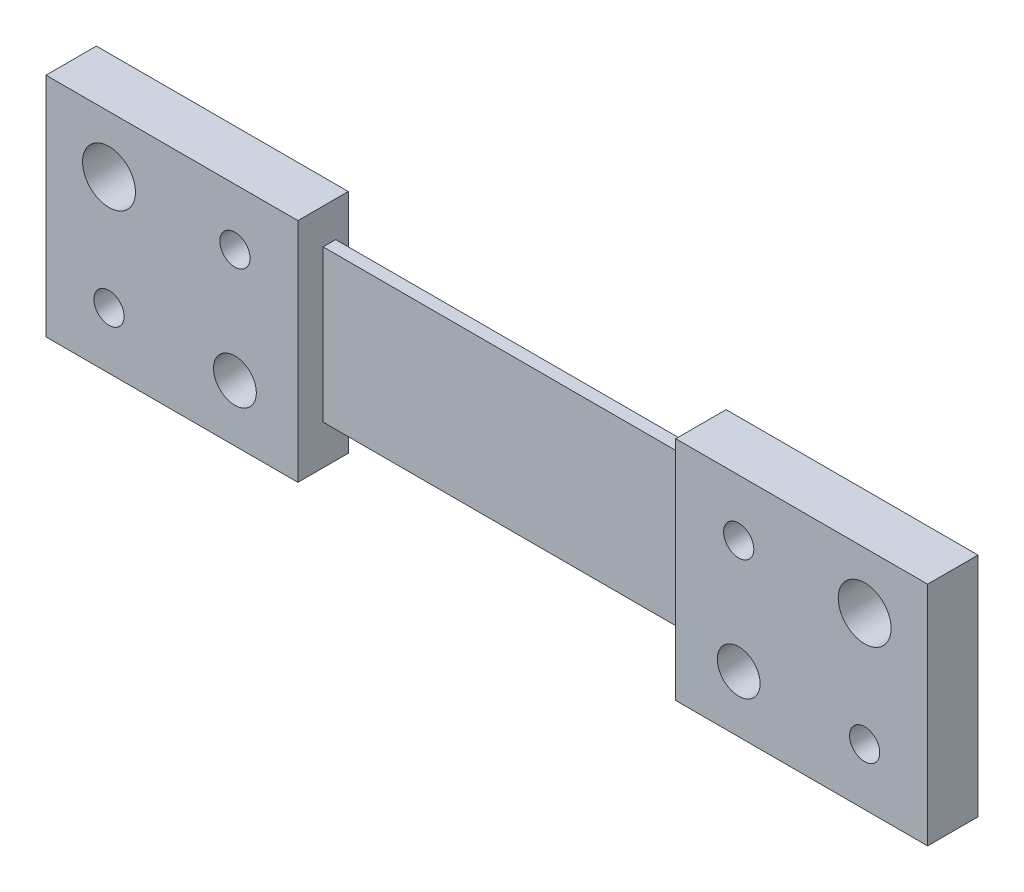
ISO-10303-21;
HEADER;
FILE_DESCRIPTION(('STEP AP214'),'2;1');
FILE_NAME('part.step','',(''),(''),'','','');
FILE_SCHEMA(('AUTOMOTIVE_DESIGN { 1 0 10303 214 1 1 1 1 }'));
ENDSEC;
DATA;
#1=APPLICATION_CONTEXT('core data for automotive mechanical design processes');
#2=APPLICATION_PROTOCOL_DEFINITION('international standard','automotive_design',2000,#1);
#3=PRODUCT_CONTEXT('',#1,'mechanical');
#4=PRODUCT('Part','Part','',(#3));
#5=PRODUCT_RELATED_PRODUCT_CATEGORY('part','',(#4));
#6=PRODUCT_DEFINITION_FORMATION('','',#4);
#7=PRODUCT_DEFINITION_CONTEXT('part definition',#1,'design');
#8=PRODUCT_DEFINITION('design','',#6,#7);
#9=PRODUCT_DEFINITION_SHAPE('','',#8);
#10=(LENGTH_UNIT() NAMED_UNIT(*) SI_UNIT(.MILLI.,.METRE.));
#11=(NAMED_UNIT(*) PLANE_ANGLE_UNIT() SI_UNIT($,.RADIAN.));
#12=(NAMED_UNIT(*) SI_UNIT($,.STERADIAN.) SOLID_ANGLE_UNIT());
#13=UNCERTAINTY_MEASURE_WITH_UNIT(LENGTH_MEASURE(1.E-05),#10,'distance_accuracy_value','');
#14=(GEOMETRIC_REPRESENTATION_CONTEXT(3) GLOBAL_UNCERTAINTY_ASSIGNED_CONTEXT((#13)) GLOBAL_UNIT_ASSIGNED_CONTEXT((#10,
#11,#12)) REPRESENTATION_CONTEXT('',''));
#15=CARTESIAN_POINT('',(0.,0.,0.));
#16=DIRECTION('',(0.,0.,1.));
#17=DIRECTION('',(1.,0.,0.));
#18=AXIS2_PLACEMENT_3D('',#15,#16,#17);
#19=CARTESIAN_POINT('',(16.5251661918329,-5.8576685660019,1.));
#20=DIRECTION('',(0.,1.,0.));
#21=DIRECTION('',(0.,0.,1.));
#22=AXIS2_PLACEMENT_3D('',#19,#20,#21);
#23=PLANE('',#22);
#24=DIRECTION('',(0.,0.,-1.));
#25=VECTOR('',#24,1.);
#26=CARTESIAN_POINT('',(15.,-5.8576685660019,1.));
#27=LINE('',#26,#25);
#28=CARTESIAN_POINT('',(15.,-5.8576685660019,2.));
#29=VERTEX_POINT('',#28);
#30=CARTESIAN_POINT('',(15.,-5.8576685660019,1.));
#31=VERTEX_POINT('',#30);
#32=EDGE_CURVE('E147',#29,#31,#27,.T.);
#33=ORIENTED_EDGE('',*,*,#32,.F.);
#34=DIRECTION('',(-1.,0.,0.));
#35=VECTOR('',#34,1.);
#36=CARTESIAN_POINT('',(16.5251661918329,-5.8576685660019,2.));
#37=LINE('',#36,#35);
#38=CARTESIAN_POINT('',(-15.,-5.8576685660019,2.));
#39=VERTEX_POINT('',#38);
#40=EDGE_CURVE('E156',#29,#39,#37,.T.);
#41=ORIENTED_EDGE('',*,*,#40,.T.);
#42=DIRECTION('',(0.,0.,-1.));
#43=VECTOR('',#42,1.);
#44=CARTESIAN_POINT('',(-15.,-5.8576685660019,4.));
#45=LINE('',#44,#43);
#46=CARTESIAN_POINT('',(-15.,-5.8576685660019,1.));
#47=VERTEX_POINT('',#46);
#48=EDGE_CURVE('E223',#39,#47,#45,.T.);
#49=ORIENTED_EDGE('',*,*,#48,.T.);
#50=DIRECTION('',(-1.,0.,0.));
#51=VECTOR('',#50,1.);
#52=CARTESIAN_POINT('',(16.5251661918329,-5.8576685660019,1.));
#53=LINE('',#52,#51);
#54=EDGE_CURVE('E157',#31,#47,#53,.T.);
#55=ORIENTED_EDGE('',*,*,#54,.F.);
#56=EDGE_LOOP('',(#33,#41,#49,#55));
#57=FACE_BOUND('',#56,.T.);
#58=ADVANCED_FACE('F31',(#57),#23,.F.);
#59=CARTESIAN_POINT('',(16.5251661918329,6.19480056980057,1.));
#60=DIRECTION('',(0.,-1.,0.));
#61=DIRECTION('',(0.,0.,-1.));
#62=AXIS2_PLACEMENT_3D('',#59,#60,#61);
#63=PLANE('',#62);
#64=DIRECTION('',(0.,0.,1.));
#65=VECTOR('',#64,1.);
#66=CARTESIAN_POINT('',(15.,6.19480056980057,1.));
#67=LINE('',#66,#65);
#68=CARTESIAN_POINT('',(15.,6.19480056980057,1.));
#69=VERTEX_POINT('',#68);
#70=CARTESIAN_POINT('',(15.,6.19480056980057,2.));
#71=VERTEX_POINT('',#70);
#72=EDGE_CURVE('E46',#69,#71,#67,.T.);
#73=ORIENTED_EDGE('',*,*,#72,.F.);
#74=DIRECTION('',(1.,0.,0.));
#75=VECTOR('',#74,1.);
#76=CARTESIAN_POINT('',(16.5251661918329,6.19480056980057,1.));
#77=LINE('',#76,#75);
#78=CARTESIAN_POINT('',(-15.,6.19480056980057,1.));
#79=VERTEX_POINT('',#78);
#80=EDGE_CURVE('E159',#79,#69,#77,.T.);
#81=ORIENTED_EDGE('',*,*,#80,.F.);
#82=DIRECTION('',(0.,0.,1.));
#83=VECTOR('',#82,1.);
#84=CARTESIAN_POINT('',(-15.,6.19480056980057,4.));
#85=LINE('',#84,#83);
#86=CARTESIAN_POINT('',(-15.,6.19480056980057,2.));
#87=VERTEX_POINT('',#86);
#88=EDGE_CURVE('E221',#79,#87,#85,.T.);
#89=ORIENTED_EDGE('',*,*,#88,.T.);
#90=DIRECTION('',(1.,0.,0.));
#91=VECTOR('',#90,1.);
#92=CARTESIAN_POINT('',(16.5251661918329,6.19480056980057,2.));
#93=LINE('',#92,#91);
#94=EDGE_CURVE('E52',#87,#71,#93,.T.);
#95=ORIENTED_EDGE('',*,*,#94,.T.);
#96=EDGE_LOOP('',(#73,#81,#89,#95));
#97=FACE_BOUND('',#96,.T.);
#98=ADVANCED_FACE('F235',(#97),#63,.F.);
#99=CARTESIAN_POINT('',(16.5251661918329,6.19480056980057,1.));
#100=DIRECTION('',(0.,0.,1.));
#101=DIRECTION('',(1.,0.,0.));
#102=AXIS2_PLACEMENT_3D('',#99,#100,#101);
#103=PLANE('',#102);
#104=DIRECTION('',(0.,1.,0.));
#105=VECTOR('',#104,1.);
#106=CARTESIAN_POINT('',(15.,6.19480056980057,1.));
#107=LINE('',#106,#105);
#108=EDGE_CURVE('E154',#31,#69,#107,.T.);
#109=ORIENTED_EDGE('',*,*,#108,.F.);
#110=ORIENTED_EDGE('',*,*,#54,.T.);
#111=DIRECTION('',(0.,1.,0.));
#112=VECTOR('',#111,1.);
#113=CARTESIAN_POINT('',(-15.,-9.,1.));
#114=LINE('',#113,#112);
#115=EDGE_CURVE('E39',#47,#79,#114,.T.);
#116=ORIENTED_EDGE('',*,*,#115,.T.);
#117=ORIENTED_EDGE('',*,*,#80,.T.);
#118=EDGE_LOOP('',(#109,#110,#116,#117));
#119=FACE_BOUND('',#118,.T.);
#120=ADVANCED_FACE('F229',(#119),#103,.F.);
#121=CARTESIAN_POINT('',(16.5251661918329,6.19480056980057,2.));
#122=DIRECTION('',(0.,0.,1.));
#123=DIRECTION('',(1.,0.,0.));
#124=AXIS2_PLACEMENT_3D('',#121,#122,#123);
#125=PLANE('',#124);
#126=ORIENTED_EDGE('',*,*,#40,.F.);
#127=DIRECTION('',(0.,1.,0.));
#128=VECTOR('',#127,1.);
#129=CARTESIAN_POINT('',(15.,6.19480056980057,2.));
#130=LINE('',#129,#128);
#131=EDGE_CURVE('E11',#29,#71,#130,.T.);
#132=ORIENTED_EDGE('',*,*,#131,.T.);
#133=ORIENTED_EDGE('',*,*,#94,.F.);
#134=DIRECTION('',(0.,1.,0.));
#135=VECTOR('',#134,1.);
#136=CARTESIAN_POINT('',(-15.,-9.,2.));
#137=LINE('',#136,#135);
#138=EDGE_CURVE('E218',#39,#87,#137,.T.);
#139=ORIENTED_EDGE('',*,*,#138,.F.);
#140=EDGE_LOOP('',(#126,#132,#133,#139));
#141=FACE_BOUND('',#140,.T.);
#142=ADVANCED_FACE('F238',(#141),#125,.T.);
#143=CARTESIAN_POINT('',(-15.,-9.,4.));
#144=DIRECTION('',(-1.,0.,0.));
#145=DIRECTION('',(0.,0.,1.));
#146=AXIS2_PLACEMENT_3D('',#143,#144,#145);
#147=PLANE('',#146);
#148=DIRECTION('',(0.,1.,0.));
#149=VECTOR('',#148,1.);
#150=CARTESIAN_POINT('',(-15.,-9.,0.));
#151=LINE('',#150,#149);
#152=CARTESIAN_POINT('',(-15.,-9.,0.));
#153=VERTEX_POINT('',#152);
#154=CARTESIAN_POINT('',(-15.,9.,0.));
#155=VERTEX_POINT('',#154);
#156=EDGE_CURVE('E204',#153,#155,#151,.T.);
#157=ORIENTED_EDGE('',*,*,#156,.T.);
#158=DIRECTION('',(0.,0.,-1.));
#159=VECTOR('',#158,1.);
#160=CARTESIAN_POINT('',(-15.,9.,4.));
#161=LINE('',#160,#159);
#162=CARTESIAN_POINT('',(-15.,9.,4.));
#163=VERTEX_POINT('',#162);
#164=EDGE_CURVE('E209',#163,#155,#161,.T.);
#165=ORIENTED_EDGE('',*,*,#164,.F.);
#166=DIRECTION('',(0.,1.,0.));
#167=VECTOR('',#166,1.);
#168=CARTESIAN_POINT('',(-15.,-9.,4.));
#169=LINE('',#168,#167);
#170=CARTESIAN_POINT('',(-15.,-9.,4.));
#171=VERTEX_POINT('',#170);
#172=EDGE_CURVE('E195',#171,#163,#169,.T.);
#173=ORIENTED_EDGE('',*,*,#172,.F.);
#174=DIRECTION('',(0.,0.,-1.));
#175=VECTOR('',#174,1.);
#176=CARTESIAN_POINT('',(-15.,-9.,4.));
#177=LINE('',#176,#175);
#178=EDGE_CURVE('E212',#171,#153,#177,.T.);
#179=ORIENTED_EDGE('',*,*,#178,.T.);
#180=EDGE_LOOP('',(#157,#165,#173,#179));
#181=FACE_BOUND('',#180,.T.);
#182=ORIENTED_EDGE('',*,*,#115,.F.);
#183=ORIENTED_EDGE('',*,*,#48,.F.);
#184=ORIENTED_EDGE('',*,*,#138,.T.);
#185=ORIENTED_EDGE('',*,*,#88,.F.);
#186=EDGE_LOOP('',(#182,#183,#184,#185));
#187=FACE_BOUND('',#186,.T.);
#188=ADVANCED_FACE('F236',(#181,#187),#147,.F.);
#189=CARTESIAN_POINT('',(-35.,9.,4.));
#190=DIRECTION('',(0.,0.,-1.));
#191=DIRECTION('',(-1.,0.,0.));
#192=AXIS2_PLACEMENT_3D('',#189,#190,#191);
#193=PLANE('',#192);
#194=CARTESIAN_POINT('',(-20.,-4.5,4.));
#195=DIRECTION('',(0.,0.,1.));
#196=DIRECTION('',(1.,0.,0.));
#197=AXIS2_PLACEMENT_3D('',#194,#195,#196);
#198=CIRCLE('',#197,1.7);
#199=CARTESIAN_POINT('',(-18.3,-4.5,4.));
#200=VERTEX_POINT('',#199);
#201=EDGE_CURVE('E171',#200,#200,#198,.T.);
#202=ORIENTED_EDGE('',*,*,#201,.F.);
#203=EDGE_LOOP('',(#202));
#204=FACE_BOUND('',#203,.T.);
#205=CARTESIAN_POINT('',(-30.,4.5,4.));
#206=DIRECTION('',(0.,0.,1.));
#207=DIRECTION('',(1.,0.,0.));
#208=AXIS2_PLACEMENT_3D('',#205,#206,#207);
#209=CIRCLE('',#208,2.1);
#210=CARTESIAN_POINT('',(-27.9,4.5,4.));
#211=VERTEX_POINT('',#210);
#212=EDGE_CURVE('E183',#211,#211,#209,.T.);
#213=ORIENTED_EDGE('',*,*,#212,.F.);
#214=EDGE_LOOP('',(#213));
#215=FACE_BOUND('',#214,.T.);
#216=DIRECTION('',(0.,-1.,0.));
#217=VECTOR('',#216,1.);
#218=CARTESIAN_POINT('',(-35.,-9.,4.));
#219=LINE('',#218,#217);
#220=CARTESIAN_POINT('',(-35.,9.,4.));
#221=VERTEX_POINT('',#220);
#222=CARTESIAN_POINT('',(-35.,-9.,4.));
#223=VERTEX_POINT('',#222);
#224=EDGE_CURVE('E189',#221,#223,#219,.T.);
#225=ORIENTED_EDGE('',*,*,#224,.T.);
#226=DIRECTION('',(1.,0.,0.));
#227=VECTOR('',#226,1.);
#228=CARTESIAN_POINT('',(-35.,-9.,4.));
#229=LINE('',#228,#227);
#230=EDGE_CURVE('E192',#223,#171,#229,.T.);
#231=ORIENTED_EDGE('',*,*,#230,.T.);
#232=ORIENTED_EDGE('',*,*,#172,.T.);
#233=DIRECTION('',(-1.,0.,0.));
#234=VECTOR('',#233,1.);
#235=CARTESIAN_POINT('',(-35.,9.,4.));
#236=LINE('',#235,#234);
#237=EDGE_CURVE('E197',#163,#221,#236,.T.);
#238=ORIENTED_EDGE('',*,*,#237,.T.);
#239=EDGE_LOOP('',(#225,#231,#232,#238));
#240=FACE_BOUND('',#239,.T.);
#241=CARTESIAN_POINT('',(-20.,4.5,4.));
#242=DIRECTION('',(0.,0.,1.));
#243=DIRECTION('',(1.,0.,0.));
#244=AXIS2_PLACEMENT_3D('',#241,#242,#243);
#245=CIRCLE('',#244,1.2);
#246=CARTESIAN_POINT('',(-18.8,4.5,4.));
#247=VERTEX_POINT('',#246);
#248=EDGE_CURVE('E177',#247,#247,#245,.T.);
#249=ORIENTED_EDGE('',*,*,#248,.F.);
#250=EDGE_LOOP('',(#249));
#251=FACE_BOUND('',#250,.T.);
#252=CARTESIAN_POINT('',(-30.,-4.5,4.));
#253=DIRECTION('',(0.,0.,1.));
#254=DIRECTION('',(1.,0.,0.));
#255=AXIS2_PLACEMENT_3D('',#252,#253,#254);
#256=CIRCLE('',#255,1.2);
#257=CARTESIAN_POINT('',(-28.8,-4.5,4.));
#258=VERTEX_POINT('',#257);
#259=EDGE_CURVE('E165',#258,#258,#256,.T.);
#260=ORIENTED_EDGE('',*,*,#259,.F.);
#261=EDGE_LOOP('',(#260));
#262=FACE_BOUND('',#261,.T.);
#263=ADVANCED_FACE('F278',(#204,#215,#240,#251,#262),#193,.F.);
#264=CARTESIAN_POINT('',(-35.,9.,0.));
#265=DIRECTION('',(0.,0.,-1.));
#266=DIRECTION('',(-1.,0.,0.));
#267=AXIS2_PLACEMENT_3D('',#264,#265,#266);
#268=PLANE('',#267);
#269=CARTESIAN_POINT('',(-20.,-4.5,0.));
#270=DIRECTION('',(0.,0.,1.));
#271=DIRECTION('',(1.,0.,0.));
#272=AXIS2_PLACEMENT_3D('',#269,#270,#271);
#273=CIRCLE('',#272,1.7);
#274=CARTESIAN_POINT('',(-18.3,-4.5,0.));
#275=VERTEX_POINT('',#274);
#276=EDGE_CURVE('E168',#275,#275,#273,.T.);
#277=ORIENTED_EDGE('',*,*,#276,.T.);
#278=EDGE_LOOP('',(#277));
#279=FACE_BOUND('',#278,.T.);
#280=CARTESIAN_POINT('',(-30.,4.5,0.));
#281=DIRECTION('',(0.,0.,1.));
#282=DIRECTION('',(1.,0.,0.));
#283=AXIS2_PLACEMENT_3D('',#280,#281,#282);
#284=CIRCLE('',#283,2.1);
#285=CARTESIAN_POINT('',(-27.9,4.5,0.));
#286=VERTEX_POINT('',#285);
#287=EDGE_CURVE('E180',#286,#286,#284,.T.);
#288=ORIENTED_EDGE('',*,*,#287,.T.);
#289=EDGE_LOOP('',(#288));
#290=FACE_BOUND('',#289,.T.);
#291=DIRECTION('',(0.,-1.,0.));
#292=VECTOR('',#291,1.);
#293=CARTESIAN_POINT('',(-35.,-9.,0.));
#294=LINE('',#293,#292);
#295=CARTESIAN_POINT('',(-35.,9.,0.));
#296=VERTEX_POINT('',#295);
#297=CARTESIAN_POINT('',(-35.,-9.,0.));
#298=VERTEX_POINT('',#297);
#299=EDGE_CURVE('E186',#296,#298,#294,.T.);
#300=ORIENTED_EDGE('',*,*,#299,.F.);
#301=DIRECTION('',(-1.,0.,0.));
#302=VECTOR('',#301,1.);
#303=CARTESIAN_POINT('',(-35.,9.,0.));
#304=LINE('',#303,#302);
#305=EDGE_CURVE('E193',#155,#296,#304,.T.);
#306=ORIENTED_EDGE('',*,*,#305,.F.);
#307=ORIENTED_EDGE('',*,*,#156,.F.);
#308=DIRECTION('',(1.,0.,0.));
#309=VECTOR('',#308,1.);
#310=CARTESIAN_POINT('',(-35.,-9.,0.));
#311=LINE('',#310,#309);
#312=EDGE_CURVE('E202',#298,#153,#311,.T.);
#313=ORIENTED_EDGE('',*,*,#312,.F.);
#314=EDGE_LOOP('',(#300,#306,#307,#313));
#315=FACE_BOUND('',#314,.T.);
#316=CARTESIAN_POINT('',(-20.,4.5,0.));
#317=DIRECTION('',(0.,0.,1.));
#318=DIRECTION('',(1.,0.,0.));
#319=AXIS2_PLACEMENT_3D('',#316,#317,#318);
#320=CIRCLE('',#319,1.2);
#321=CARTESIAN_POINT('',(-18.8,4.5,0.));
#322=VERTEX_POINT('',#321);
#323=EDGE_CURVE('E174',#322,#322,#320,.T.);
#324=ORIENTED_EDGE('',*,*,#323,.T.);
#325=EDGE_LOOP('',(#324));
#326=FACE_BOUND('',#325,.T.);
#327=CARTESIAN_POINT('',(-30.,-4.5,0.));
#328=DIRECTION('',(0.,0.,1.));
#329=DIRECTION('',(1.,0.,0.));
#330=AXIS2_PLACEMENT_3D('',#327,#328,#329);
#331=CIRCLE('',#330,1.2);
#332=CARTESIAN_POINT('',(-28.8,-4.5,0.));
#333=VERTEX_POINT('',#332);
#334=EDGE_CURVE('E162',#333,#333,#331,.T.);
#335=ORIENTED_EDGE('',*,*,#334,.T.);
#336=EDGE_LOOP('',(#335));
#337=FACE_BOUND('',#336,.T.);
#338=ADVANCED_FACE('F281',(#279,#290,#315,#326,#337),#268,.T.);
#339=CARTESIAN_POINT('',(-35.,-9.,4.));
#340=DIRECTION('',(1.,0.,0.));
#341=DIRECTION('',(0.,0.,-1.));
#342=AXIS2_PLACEMENT_3D('',#339,#340,#341);
#343=PLANE('',#342);
#344=ORIENTED_EDGE('',*,*,#299,.T.);
#345=DIRECTION('',(0.,0.,-1.));
#346=VECTOR('',#345,1.);
#347=CARTESIAN_POINT('',(-35.,-9.,4.));
#348=LINE('',#347,#346);
#349=EDGE_CURVE('E215',#223,#298,#348,.T.);
#350=ORIENTED_EDGE('',*,*,#349,.F.);
#351=ORIENTED_EDGE('',*,*,#224,.F.);
#352=DIRECTION('',(0.,0.,-1.));
#353=VECTOR('',#352,1.);
#354=CARTESIAN_POINT('',(-35.,9.,4.));
#355=LINE('',#354,#353);
#356=EDGE_CURVE('E199',#221,#296,#355,.T.);
#357=ORIENTED_EDGE('',*,*,#356,.T.);
#358=EDGE_LOOP('',(#344,#350,#351,#357));
#359=FACE_BOUND('',#358,.T.);
#360=ADVANCED_FACE('F33',(#359),#343,.F.);
#361=CARTESIAN_POINT('',(-35.,-9.,4.));
#362=DIRECTION('',(0.,1.,0.));
#363=DIRECTION('',(0.,0.,1.));
#364=AXIS2_PLACEMENT_3D('',#361,#362,#363);
#365=PLANE('',#364);
#366=ORIENTED_EDGE('',*,*,#312,.T.);
#367=ORIENTED_EDGE('',*,*,#178,.F.);
#368=ORIENTED_EDGE('',*,*,#230,.F.);
#369=ORIENTED_EDGE('',*,*,#349,.T.);
#370=EDGE_LOOP('',(#366,#367,#368,#369));
#371=FACE_BOUND('',#370,.T.);
#372=ADVANCED_FACE('F288',(#371),#365,.F.);
#373=CARTESIAN_POINT('',(-35.,9.,4.));
#374=DIRECTION('',(0.,-1.,0.));
#375=DIRECTION('',(0.,0.,-1.));
#376=AXIS2_PLACEMENT_3D('',#373,#374,#375);
#377=PLANE('',#376);
#378=ORIENTED_EDGE('',*,*,#305,.T.);
#379=ORIENTED_EDGE('',*,*,#356,.F.);
#380=ORIENTED_EDGE('',*,*,#237,.F.);
#381=ORIENTED_EDGE('',*,*,#164,.T.);
#382=EDGE_LOOP('',(#378,#379,#380,#381));
#383=FACE_BOUND('',#382,.T.);
#384=ADVANCED_FACE('F276',(#383),#377,.F.);
#385=CARTESIAN_POINT('',(-30.,4.5,4.));
#386=DIRECTION('',(0.,0.,-1.));
#387=DIRECTION('',(-1.,0.,0.));
#388=AXIS2_PLACEMENT_3D('',#385,#386,#387);
#389=CYLINDRICAL_SURFACE('',#388,2.1);
#390=ORIENTED_EDGE('',*,*,#212,.T.);
#391=EDGE_LOOP('',(#390));
#392=FACE_BOUND('',#391,.T.);
#393=ORIENTED_EDGE('',*,*,#287,.F.);
#394=EDGE_LOOP('',(#393));
#395=FACE_BOUND('',#394,.T.);
#396=ADVANCED_FACE('F272',(#392,#395),#389,.F.);
#397=CARTESIAN_POINT('',(-20.,4.5,4.));
#398=DIRECTION('',(0.,0.,-1.));
#399=DIRECTION('',(-1.,0.,0.));
#400=AXIS2_PLACEMENT_3D('',#397,#398,#399);
#401=CYLINDRICAL_SURFACE('',#400,1.2);
#402=ORIENTED_EDGE('',*,*,#248,.T.);
#403=EDGE_LOOP('',(#402));
#404=FACE_BOUND('',#403,.T.);
#405=ORIENTED_EDGE('',*,*,#323,.F.);
#406=EDGE_LOOP('',(#405));
#407=FACE_BOUND('',#406,.T.);
#408=ADVANCED_FACE('F268',(#404,#407),#401,.F.);
#409=CARTESIAN_POINT('',(-20.,-4.5,4.));
#410=DIRECTION('',(0.,0.,-1.));
#411=DIRECTION('',(-1.,0.,0.));
#412=AXIS2_PLACEMENT_3D('',#409,#410,#411);
#413=CYLINDRICAL_SURFACE('',#412,1.7);
#414=ORIENTED_EDGE('',*,*,#201,.T.);
#415=EDGE_LOOP('',(#414));
#416=FACE_BOUND('',#415,.T.);
#417=ORIENTED_EDGE('',*,*,#276,.F.);
#418=EDGE_LOOP('',(#417));
#419=FACE_BOUND('',#418,.T.);
#420=ADVANCED_FACE('F253',(#416,#419),#413,.F.);
#421=CARTESIAN_POINT('',(-30.,-4.5,4.));
#422=DIRECTION('',(0.,0.,-1.));
#423=DIRECTION('',(-1.,0.,0.));
#424=AXIS2_PLACEMENT_3D('',#421,#422,#423);
#425=CYLINDRICAL_SURFACE('',#424,1.2);
#426=ORIENTED_EDGE('',*,*,#259,.T.);
#427=EDGE_LOOP('',(#426));
#428=FACE_BOUND('',#427,.T.);
#429=ORIENTED_EDGE('',*,*,#334,.F.);
#430=EDGE_LOOP('',(#429));
#431=FACE_BOUND('',#430,.T.);
#432=ADVANCED_FACE('F243',(#428,#431),#425,.F.);
#433=CARTESIAN_POINT('',(15.,-9.,4.));
#434=DIRECTION('',(1.,0.,0.));
#435=DIRECTION('',(0.,0.,-1.));
#436=AXIS2_PLACEMENT_3D('',#433,#434,#435);
#437=PLANE('',#436);
#438=DIRECTION('',(0.,-1.,0.));
#439=VECTOR('',#438,1.);
#440=CARTESIAN_POINT('',(15.,-9.,0.));
#441=LINE('',#440,#439);
#442=CARTESIAN_POINT('',(15.,9.,0.));
#443=VERTEX_POINT('',#442);
#444=CARTESIAN_POINT('',(15.,-9.,0.));
#445=VERTEX_POINT('',#444);
#446=EDGE_CURVE('E141',#443,#445,#441,.T.);
#447=ORIENTED_EDGE('',*,*,#446,.T.);
#448=DIRECTION('',(0.,0.,-1.));
#449=VECTOR('',#448,1.);
#450=CARTESIAN_POINT('',(15.,-9.,4.));
#451=LINE('',#450,#449);
#452=CARTESIAN_POINT('',(15.,-9.,4.));
#453=VERTEX_POINT('',#452);
#454=EDGE_CURVE('E513',#453,#445,#451,.T.);
#455=ORIENTED_EDGE('',*,*,#454,.F.);
#456=DIRECTION('',(0.,-1.,0.));
#457=VECTOR('',#456,1.);
#458=CARTESIAN_POINT('',(15.,-9.,4.));
#459=LINE('',#458,#457);
#460=CARTESIAN_POINT('',(15.,9.,4.));
#461=VERTEX_POINT('',#460);
#462=EDGE_CURVE('E137',#461,#453,#459,.T.);
#463=ORIENTED_EDGE('',*,*,#462,.F.);
#464=DIRECTION('',(0.,0.,-1.));
#465=VECTOR('',#464,1.);
#466=CARTESIAN_POINT('',(15.,9.,4.));
#467=LINE('',#466,#465);
#468=EDGE_CURVE('E149',#461,#443,#467,.T.);
#469=ORIENTED_EDGE('',*,*,#468,.T.);
#470=EDGE_LOOP('',(#447,#455,#463,#469));
#471=FACE_BOUND('',#470,.T.);
#472=ORIENTED_EDGE('',*,*,#32,.T.);
#473=ORIENTED_EDGE('',*,*,#108,.T.);
#474=ORIENTED_EDGE('',*,*,#72,.T.);
#475=ORIENTED_EDGE('',*,*,#131,.F.);
#476=EDGE_LOOP('',(#472,#473,#474,#475));
#477=FACE_BOUND('',#476,.T.);
#478=ADVANCED_FACE('F241',(#471,#477),#437,.F.);
#479=CARTESIAN_POINT('',(15.,-9.,4.));
#480=DIRECTION('',(0.,0.,-1.));
#481=DIRECTION('',(-1.,0.,0.));
#482=AXIS2_PLACEMENT_3D('',#479,#480,#481);
#483=PLANE('',#482);
#484=CARTESIAN_POINT('',(20.,4.5,4.));
#485=DIRECTION('',(0.,0.,1.));
#486=DIRECTION('',(-1.,0.,0.));
#487=AXIS2_PLACEMENT_3D('',#484,#485,#486);
#488=CIRCLE('',#487,1.2);
#489=CARTESIAN_POINT('',(18.8,4.5,4.));
#490=VERTEX_POINT('',#489);
#491=EDGE_CURVE('E494',#490,#490,#488,.T.);
#492=ORIENTED_EDGE('',*,*,#491,.F.);
#493=EDGE_LOOP('',(#492));
#494=FACE_BOUND('',#493,.T.);
#495=CARTESIAN_POINT('',(30.,-4.5,4.));
#496=DIRECTION('',(0.,0.,1.));
#497=DIRECTION('',(-1.,0.,0.));
#498=AXIS2_PLACEMENT_3D('',#495,#496,#497);
#499=CIRCLE('',#498,1.2);
#500=CARTESIAN_POINT('',(28.8,-4.5,4.));
#501=VERTEX_POINT('',#500);
#502=EDGE_CURVE('E506',#501,#501,#499,.T.);
#503=ORIENTED_EDGE('',*,*,#502,.F.);
#504=EDGE_LOOP('',(#503));
#505=FACE_BOUND('',#504,.T.);
#506=DIRECTION('',(1.,0.,0.));
#507=VECTOR('',#506,1.);
#508=CARTESIAN_POINT('',(35.,-9.,4.));
#509=LINE('',#508,#507);
#510=CARTESIAN_POINT('',(35.,-9.,4.));
#511=VERTEX_POINT('',#510);
#512=EDGE_CURVE('E131',#453,#511,#509,.T.);
#513=ORIENTED_EDGE('',*,*,#512,.T.);
#514=DIRECTION('',(0.,1.,0.));
#515=VECTOR('',#514,1.);
#516=CARTESIAN_POINT('',(35.,-9.,4.));
#517=LINE('',#516,#515);
#518=CARTESIAN_POINT('',(35.,9.,4.));
#519=VERTEX_POINT('',#518);
#520=EDGE_CURVE('E120',#511,#519,#517,.T.);
#521=ORIENTED_EDGE('',*,*,#520,.T.);
#522=DIRECTION('',(-1.,0.,0.));
#523=VECTOR('',#522,1.);
#524=CARTESIAN_POINT('',(35.,9.,4.));
#525=LINE('',#524,#523);
#526=EDGE_CURVE('E130',#519,#461,#525,.T.);
#527=ORIENTED_EDGE('',*,*,#526,.T.);
#528=ORIENTED_EDGE('',*,*,#462,.T.);
#529=EDGE_LOOP('',(#513,#521,#527,#528));
#530=FACE_BOUND('',#529,.T.);
#531=CARTESIAN_POINT('',(20.,-4.5,4.));
#532=DIRECTION('',(0.,0.,1.));
#533=DIRECTION('',(-1.,0.,0.));
#534=AXIS2_PLACEMENT_3D('',#531,#532,#533);
#535=CIRCLE('',#534,1.7);
#536=CARTESIAN_POINT('',(18.3,-4.5,4.));
#537=VERTEX_POINT('',#536);
#538=EDGE_CURVE('E500',#537,#537,#535,.T.);
#539=ORIENTED_EDGE('',*,*,#538,.F.);
#540=EDGE_LOOP('',(#539));
#541=FACE_BOUND('',#540,.T.);
#542=CARTESIAN_POINT('',(30.,4.5,4.));
#543=DIRECTION('',(0.,0.,1.));
#544=DIRECTION('',(-1.,0.,0.));
#545=AXIS2_PLACEMENT_3D('',#542,#543,#544);
#546=CIRCLE('',#545,2.1);
#547=CARTESIAN_POINT('',(27.9,4.5,4.));
#548=VERTEX_POINT('',#547);
#549=EDGE_CURVE('E485',#548,#548,#546,.T.);
#550=ORIENTED_EDGE('',*,*,#549,.F.);
#551=EDGE_LOOP('',(#550));
#552=FACE_BOUND('',#551,.T.);
#553=ADVANCED_FACE('F134',(#494,#505,#530,#541,#552),#483,.F.);
#554=CARTESIAN_POINT('',(15.,-9.,0.));
#555=DIRECTION('',(0.,0.,-1.));
#556=DIRECTION('',(-1.,0.,0.));
#557=AXIS2_PLACEMENT_3D('',#554,#555,#556);
#558=PLANE('',#557);
#559=CARTESIAN_POINT('',(20.,4.5,0.));
#560=DIRECTION('',(0.,0.,1.));
#561=DIRECTION('',(-1.,0.,0.));
#562=AXIS2_PLACEMENT_3D('',#559,#560,#561);
#563=CIRCLE('',#562,1.2);
#564=CARTESIAN_POINT('',(18.8,4.5,0.));
#565=VERTEX_POINT('',#564);
#566=EDGE_CURVE('E491',#565,#565,#563,.T.);
#567=ORIENTED_EDGE('',*,*,#566,.T.);
#568=EDGE_LOOP('',(#567));
#569=FACE_BOUND('',#568,.T.);
#570=CARTESIAN_POINT('',(30.,-4.5,0.));
#571=DIRECTION('',(0.,0.,1.));
#572=DIRECTION('',(-1.,0.,0.));
#573=AXIS2_PLACEMENT_3D('',#570,#571,#572);
#574=CIRCLE('',#573,1.2);
#575=CARTESIAN_POINT('',(28.8,-4.5,0.));
#576=VERTEX_POINT('',#575);
#577=EDGE_CURVE('E503',#576,#576,#574,.T.);
#578=ORIENTED_EDGE('',*,*,#577,.T.);
#579=EDGE_LOOP('',(#578));
#580=FACE_BOUND('',#579,.T.);
#581=DIRECTION('',(1.,0.,0.));
#582=VECTOR('',#581,1.);
#583=CARTESIAN_POINT('',(35.,-9.,0.));
#584=LINE('',#583,#582);
#585=CARTESIAN_POINT('',(35.,-9.,0.));
#586=VERTEX_POINT('',#585);
#587=EDGE_CURVE('E145',#445,#586,#584,.T.);
#588=ORIENTED_EDGE('',*,*,#587,.F.);
#589=ORIENTED_EDGE('',*,*,#446,.F.);
#590=DIRECTION('',(-1.,0.,0.));
#591=VECTOR('',#590,1.);
#592=CARTESIAN_POINT('',(35.,9.,0.));
#593=LINE('',#592,#591);
#594=CARTESIAN_POINT('',(35.,9.,0.));
#595=VERTEX_POINT('',#594);
#596=EDGE_CURVE('E517',#595,#443,#593,.T.);
#597=ORIENTED_EDGE('',*,*,#596,.F.);
#598=DIRECTION('',(0.,1.,0.));
#599=VECTOR('',#598,1.);
#600=CARTESIAN_POINT('',(35.,-9.,0.));
#601=LINE('',#600,#599);
#602=EDGE_CURVE('E515',#586,#595,#601,.T.);
#603=ORIENTED_EDGE('',*,*,#602,.F.);
#604=EDGE_LOOP('',(#588,#589,#597,#603));
#605=FACE_BOUND('',#604,.T.);
#606=CARTESIAN_POINT('',(20.,-4.5,0.));
#607=DIRECTION('',(0.,0.,1.));
#608=DIRECTION('',(-1.,0.,0.));
#609=AXIS2_PLACEMENT_3D('',#606,#607,#608);
#610=CIRCLE('',#609,1.7);
#611=CARTESIAN_POINT('',(18.3,-4.5,0.));
#612=VERTEX_POINT('',#611);
#613=EDGE_CURVE('E497',#612,#612,#610,.T.);
#614=ORIENTED_EDGE('',*,*,#613,.T.);
#615=EDGE_LOOP('',(#614));
#616=FACE_BOUND('',#615,.T.);
#617=CARTESIAN_POINT('',(30.,4.5,0.));
#618=DIRECTION('',(0.,0.,1.));
#619=DIRECTION('',(-1.,0.,0.));
#620=AXIS2_PLACEMENT_3D('',#617,#618,#619);
#621=CIRCLE('',#620,2.1);
#622=CARTESIAN_POINT('',(27.9,4.5,0.));
#623=VERTEX_POINT('',#622);
#624=EDGE_CURVE('E488',#623,#623,#621,.T.);
#625=ORIENTED_EDGE('',*,*,#624,.T.);
#626=EDGE_LOOP('',(#625));
#627=FACE_BOUND('',#626,.T.);
#628=ADVANCED_FACE('F250',(#569,#580,#605,#616,#627),#558,.T.);
#629=CARTESIAN_POINT('',(35.,-9.,4.));
#630=DIRECTION('',(0.,1.,0.));
#631=DIRECTION('',(0.,0.,1.));
#632=AXIS2_PLACEMENT_3D('',#629,#630,#631);
#633=PLANE('',#632);
#634=ORIENTED_EDGE('',*,*,#587,.T.);
#635=DIRECTION('',(0.,0.,-1.));
#636=VECTOR('',#635,1.);
#637=CARTESIAN_POINT('',(35.,-9.,4.));
#638=LINE('',#637,#636);
#639=EDGE_CURVE('E124',#511,#586,#638,.T.);
#640=ORIENTED_EDGE('',*,*,#639,.F.);
#641=ORIENTED_EDGE('',*,*,#512,.F.);
#642=ORIENTED_EDGE('',*,*,#454,.T.);
#643=EDGE_LOOP('',(#634,#640,#641,#642));
#644=FACE_BOUND('',#643,.T.);
#645=ADVANCED_FACE('F143',(#644),#633,.F.);
#646=CARTESIAN_POINT('',(35.,-9.,4.));
#647=DIRECTION('',(-1.,0.,0.));
#648=DIRECTION('',(0.,0.,1.));
#649=AXIS2_PLACEMENT_3D('',#646,#647,#648);
#650=PLANE('',#649);
#651=ORIENTED_EDGE('',*,*,#602,.T.);
#652=DIRECTION('',(0.,0.,-1.));
#653=VECTOR('',#652,1.);
#654=CARTESIAN_POINT('',(35.,9.,4.));
#655=LINE('',#654,#653);
#656=EDGE_CURVE('E127',#519,#595,#655,.T.);
#657=ORIENTED_EDGE('',*,*,#656,.F.);
#658=ORIENTED_EDGE('',*,*,#520,.F.);
#659=ORIENTED_EDGE('',*,*,#639,.T.);
#660=EDGE_LOOP('',(#651,#657,#658,#659));
#661=FACE_BOUND('',#660,.T.);
#662=ADVANCED_FACE('F122',(#661),#650,.F.);
#663=CARTESIAN_POINT('',(35.,9.,4.));
#664=DIRECTION('',(0.,-1.,0.));
#665=DIRECTION('',(0.,0.,-1.));
#666=AXIS2_PLACEMENT_3D('',#663,#664,#665);
#667=PLANE('',#666);
#668=ORIENTED_EDGE('',*,*,#596,.T.);
#669=ORIENTED_EDGE('',*,*,#468,.F.);
#670=ORIENTED_EDGE('',*,*,#526,.F.);
#671=ORIENTED_EDGE('',*,*,#656,.T.);
#672=EDGE_LOOP('',(#668,#669,#670,#671));
#673=FACE_BOUND('',#672,.T.);
#674=ADVANCED_FACE('F429',(#673),#667,.F.);
#675=CARTESIAN_POINT('',(30.,-4.5,4.));
#676=DIRECTION('',(0.,0.,-1.));
#677=DIRECTION('',(-1.,0.,0.));
#678=AXIS2_PLACEMENT_3D('',#675,#676,#677);
#679=CYLINDRICAL_SURFACE('',#678,1.2);
#680=ORIENTED_EDGE('',*,*,#502,.T.);
#681=EDGE_LOOP('',(#680));
#682=FACE_BOUND('',#681,.T.);
#683=ORIENTED_EDGE('',*,*,#577,.F.);
#684=EDGE_LOOP('',(#683));
#685=FACE_BOUND('',#684,.T.);
#686=ADVANCED_FACE('F437',(#682,#685),#679,.F.);
#687=CARTESIAN_POINT('',(20.,-4.5,4.));
#688=DIRECTION('',(0.,0.,-1.));
#689=DIRECTION('',(-1.,0.,0.));
#690=AXIS2_PLACEMENT_3D('',#687,#688,#689);
#691=CYLINDRICAL_SURFACE('',#690,1.7);
#692=ORIENTED_EDGE('',*,*,#538,.T.);
#693=EDGE_LOOP('',(#692));
#694=FACE_BOUND('',#693,.T.);
#695=ORIENTED_EDGE('',*,*,#613,.F.);
#696=EDGE_LOOP('',(#695));
#697=FACE_BOUND('',#696,.T.);
#698=ADVANCED_FACE('F445',(#694,#697),#691,.F.);
#699=CARTESIAN_POINT('',(20.,4.5,4.));
#700=DIRECTION('',(0.,0.,-1.));
#701=DIRECTION('',(-1.,0.,0.));
#702=AXIS2_PLACEMENT_3D('',#699,#700,#701);
#703=CYLINDRICAL_SURFACE('',#702,1.2);
#704=ORIENTED_EDGE('',*,*,#491,.T.);
#705=EDGE_LOOP('',(#704));
#706=FACE_BOUND('',#705,.T.);
#707=ORIENTED_EDGE('',*,*,#566,.F.);
#708=EDGE_LOOP('',(#707));
#709=FACE_BOUND('',#708,.T.);
#710=ADVANCED_FACE('F454',(#706,#709),#703,.F.);
#711=CARTESIAN_POINT('',(30.,4.5,4.));
#712=DIRECTION('',(0.,0.,-1.));
#713=DIRECTION('',(-1.,0.,0.));
#714=AXIS2_PLACEMENT_3D('',#711,#712,#713);
#715=CYLINDRICAL_SURFACE('',#714,2.1);
#716=ORIENTED_EDGE('',*,*,#549,.T.);
#717=EDGE_LOOP('',(#716));
#718=FACE_BOUND('',#717,.T.);
#719=ORIENTED_EDGE('',*,*,#624,.F.);
#720=EDGE_LOOP('',(#719));
#721=FACE_BOUND('',#720,.T.);
#722=ADVANCED_FACE('F462',(#718,#721),#715,.F.);
#723=CLOSED_SHELL('',(#58,#98,#120,#142,#188,#263,#338,#360,#372,#384,#396,#408,#420,#432,#478,
#553,#628,#645,#662,#674,#686,#698,#710,#722));
#724=MANIFOLD_SOLID_BREP('B2',#723);
#725=ADVANCED_BREP_SHAPE_REPRESENTATION('',(#18,#724),#14);
#726=SHAPE_DEFINITION_REPRESENTATION(#9,#725);
ENDSEC;
END-ISO-10303-21;
